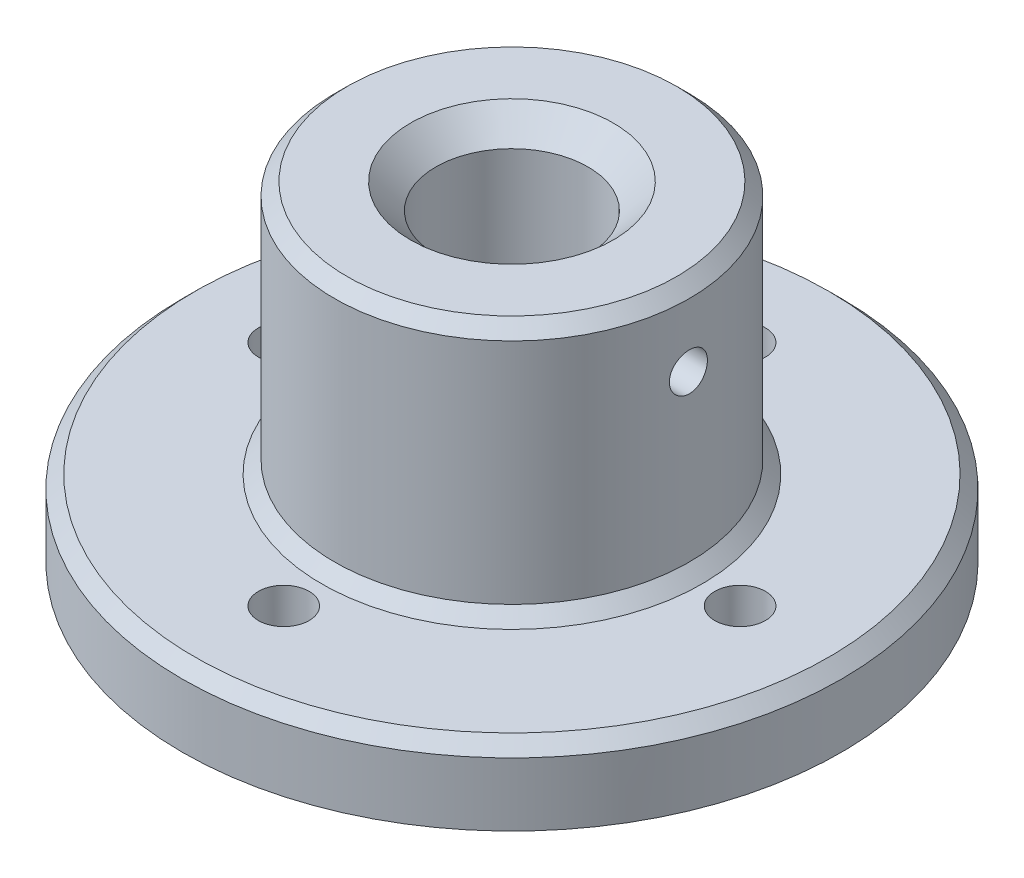
ISO-10303-21;
HEADER;
FILE_DESCRIPTION(('STEP AP214'),'2;1');
FILE_NAME('part.step','',(''),(''),'','','');
FILE_SCHEMA(('AUTOMOTIVE_DESIGN { 1 0 10303 214 1 1 1 1 }'));
ENDSEC;
DATA;
#1=APPLICATION_CONTEXT('core data for automotive mechanical design processes');
#2=APPLICATION_PROTOCOL_DEFINITION('international standard','automotive_design',2000,#1);
#3=PRODUCT_CONTEXT('',#1,'mechanical');
#4=PRODUCT('Part','Part','',(#3));
#5=PRODUCT_RELATED_PRODUCT_CATEGORY('part','',(#4));
#6=PRODUCT_DEFINITION_FORMATION('','',#4);
#7=PRODUCT_DEFINITION_CONTEXT('part definition',#1,'design');
#8=PRODUCT_DEFINITION('design','',#6,#7);
#9=PRODUCT_DEFINITION_SHAPE('','',#8);
#10=(LENGTH_UNIT() NAMED_UNIT(*) SI_UNIT(.MILLI.,.METRE.));
#11=(NAMED_UNIT(*) PLANE_ANGLE_UNIT() SI_UNIT($,.RADIAN.));
#12=(NAMED_UNIT(*) SI_UNIT($,.STERADIAN.) SOLID_ANGLE_UNIT());
#13=UNCERTAINTY_MEASURE_WITH_UNIT(LENGTH_MEASURE(1.E-05),#10,'distance_accuracy_value','');
#14=(GEOMETRIC_REPRESENTATION_CONTEXT(3) GLOBAL_UNCERTAINTY_ASSIGNED_CONTEXT((#13)) GLOBAL_UNIT_ASSIGNED_CONTEXT((#10,
#11,#12)) REPRESENTATION_CONTEXT('',''));
#15=CARTESIAN_POINT('',(0.,0.,0.));
#16=DIRECTION('',(0.,0.,1.));
#17=DIRECTION('',(1.,0.,0.));
#18=AXIS2_PLACEMENT_3D('',#15,#16,#17);
#19=CARTESIAN_POINT('',(0.,48.361075518852,0.));
#20=DIRECTION('',(0.,1.,0.));
#21=DIRECTION('',(0.,0.,1.));
#22=AXIS2_PLACEMENT_3D('',#19,#20,#21);
#23=CYLINDRICAL_SURFACE('',#22,9.525);
#24=CARTESIAN_POINT('',(0.,38.1,0.));
#25=DIRECTION('',(0.,-1.,0.));
#26=DIRECTION('',(0.,0.,-1.));
#27=AXIS2_PLACEMENT_3D('',#24,#25,#26);
#28=CIRCLE('',#27,9.525);
#29=CARTESIAN_POINT('',(0.,38.1,9.525));
#30=VERTEX_POINT('',#29);
#31=EDGE_CURVE('E129',#30,#30,#28,.F.);
#32=ORIENTED_EDGE('',*,*,#31,.T.);
#33=EDGE_LOOP('',(#32));
#34=FACE_BOUND('',#33,.T.);
#35=CARTESIAN_POINT('',(0.,12.7,0.));
#36=DIRECTION('',(0.,1.,0.));
#37=DIRECTION('',(0.,0.,1.));
#38=AXIS2_PLACEMENT_3D('',#35,#36,#37);
#39=CIRCLE('',#38,9.525);
#40=CARTESIAN_POINT('',(0.,12.7,9.525));
#41=VERTEX_POINT('',#40);
#42=EDGE_CURVE('E109',#41,#41,#39,.T.);
#43=ORIENTED_EDGE('',*,*,#42,.F.);
#44=EDGE_LOOP('',(#43));
#45=FACE_BOUND('',#44,.T.);
#46=CARTESIAN_POINT('',(9.22254159315641,31.75,2.38125));
#47=CARTESIAN_POINT('',(9.22254410333687,31.8814933402576,2.3812462648599));
#48=CARTESIAN_POINT('',(9.22538451478904,32.0130280159913,2.37032124883651));
#49=CARTESIAN_POINT('',(9.23641023547917,32.2723201182103,2.32697952700426));
#50=CARTESIAN_POINT('',(9.24459865537102,32.4000753011309,2.29455031317185));
#51=CARTESIAN_POINT('',(9.26533635177833,32.6480203701233,2.20931536764952));
#52=CARTESIAN_POINT('',(9.27787999662661,32.7682197905049,2.1565359407814));
#53=CARTESIAN_POINT('',(9.30590777907392,32.9980710870442,2.03217888705147));
#54=CARTESIAN_POINT('',(9.32139204150511,33.1077225151314,1.96060046210405));
#55=CARTESIAN_POINT('',(9.35393782328732,33.3157782171123,1.79899477701457));
#56=CARTESIAN_POINT('',(9.3710245423594,33.4139161543334,1.70862963553811));
#57=CARTESIAN_POINT('',(9.40463138928317,33.5938127281282,1.51274341605588));
#58=CARTESIAN_POINT('',(9.42115146404485,33.6755698334047,1.40722092270674));
#59=CARTESIAN_POINT('',(9.45204245783355,33.8214736329188,1.18219080402771));
#60=CARTESIAN_POINT('',(9.46638017249064,33.8853586847238,1.06250858382585));
#61=CARTESIAN_POINT('',(9.49100348359499,33.9920036860558,0.813685683038861));
#62=CARTESIAN_POINT('',(9.50128967785963,34.0347667524495,0.684546401216829));
#63=CARTESIAN_POINT('',(9.51647282802892,34.0971008124361,0.423251717713344));
#64=CARTESIAN_POINT('',(9.52147473886709,34.1171240862211,0.291210415370404));
#65=CARTESIAN_POINT('',(9.52589148387201,34.13482985626,0.0255544503477919));
#66=CARTESIAN_POINT('',(9.52530714407111,34.1325156555296,-0.108059976797507));
#67=CARTESIAN_POINT('',(9.5186953544324,34.1059374551367,-0.369932538579244));
#68=CARTESIAN_POINT('',(9.51278897229679,34.0821616503862,-0.498243738400037));
#69=CARTESIAN_POINT('',(9.49633771789926,34.0141198652788,-0.748994201653837));
#70=CARTESIAN_POINT('',(9.48579259872026,33.969852794178,-0.871433152125852));
#71=CARTESIAN_POINT('',(9.46106352990092,33.8616900514206,-1.10824971271367));
#72=CARTESIAN_POINT('',(9.44684756259498,33.7976206399597,-1.22254448888149));
#73=CARTESIAN_POINT('',(9.41631883378731,33.6518037156418,-1.43893132569829));
#74=CARTESIAN_POINT('',(9.40000570769149,33.570053127196,-1.54102125854736));
#75=CARTESIAN_POINT('',(9.36653937365312,33.3885774232618,-1.73301192104605));
#76=CARTESIAN_POINT('',(9.34937537847846,33.2884257150388,-1.82250797329781));
#77=CARTESIAN_POINT('',(9.31654578950254,33.0743560252029,-1.98352499526194));
#78=CARTESIAN_POINT('',(9.30088026575645,32.9604374005347,-2.0550451248346));
#79=CARTESIAN_POINT('',(9.27278273229926,32.7212737424732,-2.17833923223503));
#80=CARTESIAN_POINT('',(9.26036676990449,32.595976466877,-2.23001578134838));
#81=CARTESIAN_POINT('',(9.24038004741607,32.3380873416568,-2.31144513414038));
#82=CARTESIAN_POINT('',(9.23280825052703,32.2054970595547,-2.34120262935448));
#83=CARTESIAN_POINT('',(9.22358476597102,31.9405385747928,-2.37727773082929));
#84=CARTESIAN_POINT('',(9.22178199750529,31.8082570018427,-2.38419367640796));
#85=CARTESIAN_POINT('',(9.22388944554869,31.5444296054026,-2.37602743346569));
#86=CARTESIAN_POINT('',(9.22779913615711,31.4128837153032,-2.36094726995194));
#87=CARTESIAN_POINT('',(9.24074620590693,31.1564836626365,-2.30974150440119));
#88=CARTESIAN_POINT('',(9.24969864156011,31.0315552279428,-2.27396427503852));
#89=CARTESIAN_POINT('',(9.27164184145322,30.7894690363947,-2.18276622279112));
#90=CARTESIAN_POINT('',(9.28463308404703,30.6723122019994,-2.12734307294616));
#91=CARTESIAN_POINT('',(9.31350820583475,30.4465596828318,-1.99717406120961));
#92=CARTESIAN_POINT('',(9.329443830984,30.3381770298591,-1.92207047052845));
#93=CARTESIAN_POINT('',(9.36228521625235,30.1353330844316,-1.75512482255016));
#94=CARTESIAN_POINT('',(9.37919113548712,30.0408740843908,-1.66328001450545));
#95=CARTESIAN_POINT('',(9.41258026387764,29.8661349819512,-1.46271310434489));
#96=CARTESIAN_POINT('',(9.42904231213941,29.7862687904223,-1.35362621196586));
#97=CARTESIAN_POINT('',(9.45925098824539,29.6459885867289,-1.1232420131667));
#98=CARTESIAN_POINT('',(9.47299775771261,29.5855735599307,-1.00194534408027));
#99=CARTESIAN_POINT('',(9.49614035240754,29.4864351521122,-0.751422967872166));
#100=CARTESIAN_POINT('',(9.50556738096345,29.4475557691289,-0.622262013572651));
#101=CARTESIAN_POINT('',(9.51914491959489,29.3921240312855,-0.358972866759166));
#102=CARTESIAN_POINT('',(9.52329644797234,29.3755673675511,-0.22484563800446));
#103=CARTESIAN_POINT('',(9.52581365904719,29.3654934273232,0.0406801473431576));
#104=CARTESIAN_POINT('',(9.52433274707972,29.3713653052166,0.172054425462833));
#105=CARTESIAN_POINT('',(9.51609165939287,29.4045826387447,0.43188135083762));
#106=CARTESIAN_POINT('',(9.50933164068008,29.4319274557501,0.560334084865831));
#107=CARTESIAN_POINT('',(9.49131561983323,29.5069868483294,0.810032278629114));
#108=CARTESIAN_POINT('',(9.48008401721322,29.5545909732049,0.931312815220676));
#109=CARTESIAN_POINT('',(9.45430756725648,29.6687174412904,1.16423373255536));
#110=CARTESIAN_POINT('',(9.43976230230416,29.7352421692966,1.27587289576378));
#111=CARTESIAN_POINT('',(9.40849138301183,29.8871844009533,1.48923834205799));
#112=CARTESIAN_POINT('',(9.39172184092338,29.9730163402897,1.59066306588541));
#113=CARTESIAN_POINT('',(9.35808983067433,30.1603319162711,1.77787701702628));
#114=CARTESIAN_POINT('',(9.34122734003389,30.2618195152397,1.86366227408863));
#115=CARTESIAN_POINT('',(9.30896051857103,30.4798446175386,2.01873332553604));
#116=CARTESIAN_POINT('',(9.29358925997019,30.5966275687635,2.08768144998525));
#117=CARTESIAN_POINT('',(9.26649044022059,30.8404946352644,2.20486342249415));
#118=CARTESIAN_POINT('',(9.2547602298034,30.967571175511,2.25311234134731));
#119=CARTESIAN_POINT('',(9.23810482712693,31.2036865094325,2.3203436461597));
#120=CARTESIAN_POINT('',(9.23231253777081,31.3115955976945,2.34313373748382));
#121=CARTESIAN_POINT('',(9.22453003124864,31.5296602443007,2.37358783418652));
#122=CARTESIAN_POINT('',(9.22253948975938,31.639815610207,2.38125312984773));
#123=CARTESIAN_POINT('',(9.22254159315641,31.75,2.38125));
#124=B_SPLINE_CURVE_WITH_KNOTS('',3,(#46,#47,#48,#49,#50,#51,#52,#53,#54,#55,#56,#57,#58,#59,
#60,#61,#62,#63,#64,#65,#66,#67,#68,#69,#70,#71,#72,#73,#74,#75,#76,#77,#78,#79,#80,#81,#82,#83,
#84,#85,#86,#87,#88,#89,#90,#91,#92,#93,#94,#95,#96,#97,#98,#99,#100,#101,#102,#103,#104,#105,
#106,#107,#108,#109,#110,#111,#112,#113,#114,#115,#116,#117,#118,#119,#120,#121,#122,#123),
.UNSPECIFIED.,.T.,.F.,(4,2,2,2,2,2,2,2,2,2,2,2,2,2,2,2,2,2,2,2,2,2,2,2,2,2,2,2,2,2,2,2,2,2,2,2,
2,2,4),(0.,0.394075388253666,0.788380193710801,1.18217701762563,1.57599056234593,
1.97761816368809,2.37928329209573,2.78655300319018,3.19376259754355,3.59272285323067,
3.99162411604384,4.38167395211221,4.77174455280358,5.16533962727358,5.55900322159139,
5.96332119409744,6.36765805967811,6.77395551488003,7.18016598123394,7.57564754962904,
7.9710927114728,8.36006778275978,8.7490889415861,9.14574160685557,9.54245950492714,
9.94910377749175,10.3557268347758,10.7593644935331,11.1629242284057,11.5555723244111,
11.9482087430628,12.3387314492783,12.7293033997022,13.1292323449913,13.5292626757086,
13.936755946198,14.343952021097,14.674194303944,15.0044084129029),.UNSPECIFIED.);
#125=CARTESIAN_POINT('',(9.22254159315641,31.75,2.38125));
#126=VERTEX_POINT('',#125);
#127=EDGE_CURVE('E102',#126,#126,#124,.T.);
#128=ORIENTED_EDGE('',*,*,#127,.F.);
#129=EDGE_LOOP('',(#128));
#130=FACE_BOUND('',#129,.T.);
#131=ADVANCED_FACE('F43',(#34,#45,#130),#23,.F.);
#132=CARTESIAN_POINT('',(0.,48.361075518852,0.));
#133=DIRECTION('',(0.,1.,0.));
#134=DIRECTION('',(0.,0.,1.));
#135=AXIS2_PLACEMENT_3D('',#132,#133,#134);
#136=CYLINDRICAL_SURFACE('',#135,22.225);
#137=CARTESIAN_POINT('',(0.,11.1125,0.));
#138=DIRECTION('',(0.,-1.,0.));
#139=DIRECTION('',(0.,0.,-1.));
#140=AXIS2_PLACEMENT_3D('',#137,#138,#139);
#141=CIRCLE('',#140,22.225);
#142=CARTESIAN_POINT('',(0.,11.1125,-22.225));
#143=VERTEX_POINT('',#142);
#144=EDGE_CURVE('E58',#143,#143,#141,.F.);
#145=ORIENTED_EDGE('',*,*,#144,.T.);
#146=EDGE_LOOP('',(#145));
#147=FACE_BOUND('',#146,.T.);
#148=CARTESIAN_POINT('',(0.,39.6875,0.));
#149=DIRECTION('',(0.,-1.,0.));
#150=DIRECTION('',(0.,0.,-1.));
#151=AXIS2_PLACEMENT_3D('',#148,#149,#150);
#152=CIRCLE('',#151,22.225);
#153=CARTESIAN_POINT('',(0.,39.6875,-22.225));
#154=VERTEX_POINT('',#153);
#155=EDGE_CURVE('E64',#154,#154,#152,.T.);
#156=ORIENTED_EDGE('',*,*,#155,.T.);
#157=EDGE_LOOP('',(#156));
#158=FACE_BOUND('',#157,.T.);
#159=CARTESIAN_POINT('',(22.0970648149816,31.75,2.38125));
#160=CARTESIAN_POINT('',(22.0970664820833,31.6166566543685,2.38124424992973));
#161=CARTESIAN_POINT('',(22.0982848074785,31.4832264094941,2.37001197710508));
#162=CARTESIAN_POINT('',(22.103025490222,31.2200689950915,2.32537598328547));
#163=CARTESIAN_POINT('',(22.1065503520364,31.0903460109325,2.2919481615033));
#164=CARTESIAN_POINT('',(22.1155003657975,30.8384519200625,2.20390885620275));
#165=CARTESIAN_POINT('',(22.1209243292955,30.7162761464657,2.14931061873866));
#166=CARTESIAN_POINT('',(22.1330599489261,30.4828477733432,2.02050658503218));
#167=CARTESIAN_POINT('',(22.1397713586554,30.3715930897875,1.9463045397249));
#168=CARTESIAN_POINT('',(22.1537568755532,30.1626776618186,1.78006856421919));
#169=CARTESIAN_POINT('',(22.1610329714682,30.0650686999907,1.68796971750633));
#170=CARTESIAN_POINT('',(22.1753100262235,29.8866617715851,1.48869356394803));
#171=CARTESIAN_POINT('',(22.1823109721801,29.8058645914429,1.38151555210987));
#172=CARTESIAN_POINT('',(22.1952687819102,29.6631936822957,1.15480366058516));
#173=CARTESIAN_POINT('',(22.2012230846248,29.6013661026044,1.03524058007845));
#174=CARTESIAN_POINT('',(22.21139501034,29.4986847732947,0.787354809851176));
#175=CARTESIAN_POINT('',(22.2156126814728,29.4578304423783,0.659032363018367));
#176=CARTESIAN_POINT('',(22.2218221520862,29.3984080668079,0.397795785244165));
#177=CARTESIAN_POINT('',(22.2238224780854,29.3797546308883,0.264901283782864));
#178=CARTESIAN_POINT('',(22.2254009087708,29.3649992193971,-0.00214606369741539));
#179=CARTESIAN_POINT('',(22.2249790848306,29.36889657932,-0.136298872521493));
#180=CARTESIAN_POINT('',(22.221767700665,29.3990630452124,-0.401474711359468));
#181=CARTESIAN_POINT('',(22.2189878589336,29.4252403266971,-0.532508321511268));
#182=CARTESIAN_POINT('',(22.2113839013471,29.4990803789974,-0.788311592666256));
#183=CARTESIAN_POINT('',(22.2065597556045,29.5467434639341,-0.913081162059909));
#184=CARTESIAN_POINT('',(22.1953927288687,29.6623020230706,-1.15310268517908));
#185=CARTESIAN_POINT('',(22.1890468204965,29.7302378944353,-1.26833504309562));
#186=CARTESIAN_POINT('',(22.1755477903151,29.8843842316627,-1.48579731158137));
#187=CARTESIAN_POINT('',(22.1683946413121,29.9705953132544,-1.58802678387106));
#188=CARTESIAN_POINT('',(22.1540408744508,30.1593607244283,-1.77711962939844));
#189=CARTESIAN_POINT('',(22.1468401986374,30.2619949730649,-1.86390323722339));
#190=CARTESIAN_POINT('',(22.1332386863532,30.4804168968983,-2.01902271559633));
#191=CARTESIAN_POINT('',(22.126837851343,30.5962045961145,-2.08735855245616));
#192=CARTESIAN_POINT('',(22.1155603723591,30.8377105009573,-2.20364359444023));
#193=CARTESIAN_POINT('',(22.1106841255728,30.9634312836921,-2.25158748820562));
#194=CARTESIAN_POINT('',(22.1030160347943,31.2212025727177,-2.32566257688787));
#195=CARTESIAN_POINT('',(22.1002241176709,31.3532528567572,-2.35179453710676));
#196=CARTESIAN_POINT('',(22.0970536725561,31.6192333605724,-2.38140056745085));
#197=CARTESIAN_POINT('',(22.096663240123,31.7531510035851,-2.38498640333515));
#198=CARTESIAN_POINT('',(22.0983085400792,32.0196802053377,-2.3696922799674));
#199=CARTESIAN_POINT('',(22.1003442347372,32.1522917843573,-2.35081267010065));
#200=CARTESIAN_POINT('',(22.1066015805646,32.4121163188876,-2.29121724578066));
#201=CARTESIAN_POINT('',(22.1108179070273,32.5393416117527,-2.25055461289328));
#202=CARTESIAN_POINT('',(22.1209571278545,32.7851662573919,-2.14860181595665));
#203=CARTESIAN_POINT('',(22.1268800668847,32.9037653842994,-2.0873111120207));
#204=CARTESIAN_POINT('',(22.1397938909874,33.1294795474858,-1.94556337590222));
#205=CARTESIAN_POINT('',(22.1467888533591,33.2365479628,-1.86503248341998));
#206=CARTESIAN_POINT('',(22.1610453754943,33.4356878876036,-1.68719582560919));
#207=CARTESIAN_POINT('',(22.1683069428381,33.5277589702789,-1.58988958302776));
#208=CARTESIAN_POINT('',(22.182314590293,33.6946779883262,-1.38077863102557));
#209=CARTESIAN_POINT('',(22.18905840639,33.7694528719469,-1.26891543643893));
#210=CARTESIAN_POINT('',(22.2012375235669,33.8991534890153,-1.03415365878414));
#211=CARTESIAN_POINT('',(22.2066728448594,33.9540795290799,-0.911255246220109));
#212=CARTESIAN_POINT('',(22.2156123861663,34.0424003554481,-0.658163427893604));
#213=CARTESIAN_POINT('',(22.2191205161404,34.075838760277,-0.527985387325592));
#214=CARTESIAN_POINT('',(22.2238265018812,34.1203773649965,-0.263822894271637));
#215=CARTESIAN_POINT('',(22.2250244328724,34.1314782922377,-0.129838565869688));
#216=CARTESIAN_POINT('',(22.2249749259624,34.1310157248106,0.137416785862918));
#217=CARTESIAN_POINT('',(22.2237397017826,34.119565430669,0.270688021772255));
#218=CARTESIAN_POINT('',(22.2189868093002,34.0745634542405,0.533401688310272));
#219=CARTESIAN_POINT('',(22.2154691399757,34.0410117620573,0.662844117224497));
#220=CARTESIAN_POINT('',(22.2065452803502,33.9527919068326,0.914221143233191));
#221=CARTESIAN_POINT('',(22.2011394374474,33.8981276280233,1.03615711656207));
#222=CARTESIAN_POINT('',(22.189040765569,33.769246209088,1.26914146534895));
#223=CARTESIAN_POINT('',(22.1823479380201,33.6950290906375,1.38018985287626));
#224=CARTESIAN_POINT('',(22.1683842038663,33.5287254322321,1.58882663735036));
#225=CARTESIAN_POINT('',(22.1611106683196,33.436554549666,1.68634763122723));
#226=CARTESIAN_POINT('',(22.146827268395,33.2371294990927,1.86458686669421));
#227=CARTESIAN_POINT('',(22.1398174674624,33.1298717307431,1.94530108606954));
#228=CARTESIAN_POINT('',(22.1268336517078,32.9029740211887,2.08782410823142));
#229=CARTESIAN_POINT('',(22.1208626774724,32.7832993157361,2.14957780509113));
#230=CARTESIAN_POINT('',(22.1106685696351,32.5352887869448,2.25202913195297));
#231=CARTESIAN_POINT('',(22.1064434841166,32.4069628235737,2.29275028929643));
#232=CARTESIAN_POINT('',(22.1012746980544,32.1899383015984,2.34193195406394));
#233=CARTESIAN_POINT('',(22.099703560649,32.1026227181193,2.35665579827022));
#234=CARTESIAN_POINT('',(22.0975980687243,31.9268841678546,2.37631670404873));
#235=CARTESIAN_POINT('',(22.097063709011,31.8384612066189,2.3812538146497));
#236=CARTESIAN_POINT('',(22.0970648149816,31.75,2.38125));
#237=B_SPLINE_CURVE_WITH_KNOTS('',3,(#159,#160,#161,#162,#163,#164,#165,#166,#167,#168,#169,
#170,#171,#172,#173,#174,#175,#176,#177,#178,#179,#180,#181,#182,#183,#184,#185,#186,#187,#188,
#189,#190,#191,#192,#193,#194,#195,#196,#197,#198,#199,#200,#201,#202,#203,#204,#205,#206,#207,
#208,#209,#210,#211,#212,#213,#214,#215,#216,#217,#218,#219,#220,#221,#222,#223,#224,#225,#226,
#227,#228,#229,#230,#231,#232,#233,#234,#235,#236),.UNSPECIFIED.,.T.,.F.,(4,2,2,2,2,2,2,2,2,2,2,
2,2,2,2,2,2,2,2,2,2,2,2,2,2,2,2,2,2,2,2,2,2,2,2,2,2,2,4),(0.,0.399706962412221,
0.799848653454276,1.19974038398277,1.59955565574399,2.0008491883463,2.4021614887709,
2.80444250027053,3.20671236148111,3.60742992033587,4.00813567128774,4.40719790603781,
4.80626597524271,5.20613463055177,5.60601676039549,6.00790755168548,6.4097990768783,
6.81179521617566,7.2137772502866,7.61376499564718,8.01374652043194,8.41275594224327,
8.81177580791213,9.21235278734627,9.61294116493745,10.0151917614922,10.4174361439794,
10.8188613949833,11.2202735746116,11.6196759178646,12.0190784399585,12.4184075161163,
12.8177361495971,13.2189880628712,13.6203358940819,14.0228393760423,14.424891630575,
14.6900622482699,14.9552315375322),.UNSPECIFIED.);
#238=CARTESIAN_POINT('',(22.0970648149816,31.75,2.38125));
#239=VERTEX_POINT('',#238);
#240=EDGE_CURVE('E48',#239,#239,#237,.T.);
#241=ORIENTED_EDGE('',*,*,#240,.F.);
#242=EDGE_LOOP('',(#241));
#243=FACE_BOUND('',#242,.T.);
#244=ADVANCED_FACE('F152',(#147,#158,#243),#136,.T.);
#245=CARTESIAN_POINT('',(41.275,0.,0.));
#246=DIRECTION('',(0.,1.,0.));
#247=DIRECTION('',(0.,0.,1.));
#248=AXIS2_PLACEMENT_3D('',#245,#246,#247);
#249=PLANE('',#248);
#250=CARTESIAN_POINT('',(0.,0.,0.));
#251=DIRECTION('',(0.,1.,0.));
#252=DIRECTION('',(0.,0.,1.));
#253=AXIS2_PLACEMENT_3D('',#250,#251,#252);
#254=CIRCLE('',#253,41.275);
#255=CARTESIAN_POINT('',(0.,0.,41.275));
#256=VERTEX_POINT('',#255);
#257=EDGE_CURVE('E77',#256,#256,#254,.T.);
#258=ORIENTED_EDGE('',*,*,#257,.F.);
#259=EDGE_LOOP('',(#258));
#260=FACE_BOUND('',#259,.T.);
#261=CARTESIAN_POINT('',(0.,0.,0.));
#262=DIRECTION('',(0.,1.,0.));
#263=DIRECTION('',(0.,0.,1.));
#264=AXIS2_PLACEMENT_3D('',#261,#262,#263);
#265=CIRCLE('',#264,34.925);
#266=CARTESIAN_POINT('',(0.,0.,34.925));
#267=VERTEX_POINT('',#266);
#268=EDGE_CURVE('E125',#267,#267,#265,.T.);
#269=ORIENTED_EDGE('',*,*,#268,.T.);
#270=EDGE_LOOP('',(#269));
#271=FACE_BOUND('',#270,.T.);
#272=ADVANCED_FACE('F174',(#260,#271),#249,.F.);
#273=CARTESIAN_POINT('',(0.,48.361075518852,0.));
#274=DIRECTION('',(0.,1.,0.));
#275=DIRECTION('',(0.,0.,1.));
#276=AXIS2_PLACEMENT_3D('',#273,#274,#275);
#277=CYLINDRICAL_SURFACE('',#276,34.925);
#278=ORIENTED_EDGE('',*,*,#268,.F.);
#279=EDGE_LOOP('',(#278));
#280=FACE_BOUND('',#279,.T.);
#281=CARTESIAN_POINT('',(0.,3.175,0.));
#282=DIRECTION('',(0.,1.,0.));
#283=DIRECTION('',(0.,0.,1.));
#284=AXIS2_PLACEMENT_3D('',#281,#282,#283);
#285=CIRCLE('',#284,34.925);
#286=CARTESIAN_POINT('',(0.,3.175,34.925));
#287=VERTEX_POINT('',#286);
#288=EDGE_CURVE('E121',#287,#287,#285,.T.);
#289=ORIENTED_EDGE('',*,*,#288,.T.);
#290=EDGE_LOOP('',(#289));
#291=FACE_BOUND('',#290,.T.);
#292=ADVANCED_FACE('F252',(#280,#291),#277,.F.);
#293=CARTESIAN_POINT('',(34.925,3.175,0.));
#294=DIRECTION('',(0.,1.,0.));
#295=DIRECTION('',(0.,0.,1.));
#296=AXIS2_PLACEMENT_3D('',#293,#294,#295);
#297=PLANE('',#296);
#298=CARTESIAN_POINT('',(0.,3.175,28.575));
#299=DIRECTION('',(0.,1.,0.));
#300=DIRECTION('',(-1.,0.,0.));
#301=AXIS2_PLACEMENT_3D('',#298,#299,#300);
#302=CIRCLE('',#301,3.175);
#303=CARTESIAN_POINT('',(-3.1750000000001,3.175,28.575));
#304=VERTEX_POINT('',#303);
#305=EDGE_CURVE('E71',#304,#304,#302,.T.);
#306=ORIENTED_EDGE('',*,*,#305,.T.);
#307=EDGE_LOOP('',(#306));
#308=FACE_BOUND('',#307,.T.);
#309=CARTESIAN_POINT('',(-28.575,3.175,0.));
#310=DIRECTION('',(0.,1.,0.));
#311=DIRECTION('',(0.,0.,-1.));
#312=AXIS2_PLACEMENT_3D('',#309,#310,#311);
#313=CIRCLE('',#312,3.175);
#314=CARTESIAN_POINT('',(-28.575,3.175,-3.175));
#315=VERTEX_POINT('',#314);
#316=EDGE_CURVE('E86',#315,#315,#313,.T.);
#317=ORIENTED_EDGE('',*,*,#316,.T.);
#318=EDGE_LOOP('',(#317));
#319=FACE_BOUND('',#318,.T.);
#320=CARTESIAN_POINT('',(2.99307237772328E-13,3.175,-28.575));
#321=DIRECTION('',(0.,1.,0.));
#322=DIRECTION('',(1.,0.,0.));
#323=AXIS2_PLACEMENT_3D('',#320,#321,#322);
#324=CIRCLE('',#323,3.175);
#325=CARTESIAN_POINT('',(3.1750000000003,3.175,-28.575));
#326=VERTEX_POINT('',#325);
#327=EDGE_CURVE('E94',#326,#326,#324,.T.);
#328=ORIENTED_EDGE('',*,*,#327,.T.);
#329=EDGE_LOOP('',(#328));
#330=FACE_BOUND('',#329,.T.);
#331=CARTESIAN_POINT('',(28.575,3.175,0.));
#332=DIRECTION('',(0.,1.,0.));
#333=DIRECTION('',(0.,0.,1.));
#334=AXIS2_PLACEMENT_3D('',#331,#332,#333);
#335=CIRCLE('',#334,3.175);
#336=CARTESIAN_POINT('',(28.575,3.175,3.175));
#337=VERTEX_POINT('',#336);
#338=EDGE_CURVE('E70',#337,#337,#335,.T.);
#339=ORIENTED_EDGE('',*,*,#338,.T.);
#340=EDGE_LOOP('',(#339));
#341=FACE_BOUND('',#340,.T.);
#342=ORIENTED_EDGE('',*,*,#288,.F.);
#343=EDGE_LOOP('',(#342));
#344=FACE_BOUND('',#343,.T.);
#345=CARTESIAN_POINT('',(0.,3.175,0.));
#346=DIRECTION('',(0.,1.,0.));
#347=DIRECTION('',(0.,0.,1.));
#348=AXIS2_PLACEMENT_3D('',#345,#346,#347);
#349=CIRCLE('',#348,12.7);
#350=CARTESIAN_POINT('',(0.,3.175,12.7));
#351=VERTEX_POINT('',#350);
#352=EDGE_CURVE('E117',#351,#351,#349,.T.);
#353=ORIENTED_EDGE('',*,*,#352,.T.);
#354=EDGE_LOOP('',(#353));
#355=FACE_BOUND('',#354,.T.);
#356=ADVANCED_FACE('F256',(#308,#319,#330,#341,#344,#355),#297,.F.);
#357=CARTESIAN_POINT('',(0.,48.361075518852,0.));
#358=DIRECTION('',(0.,1.,0.));
#359=DIRECTION('',(0.,0.,1.));
#360=AXIS2_PLACEMENT_3D('',#357,#358,#359);
#361=CYLINDRICAL_SURFACE('',#360,12.7);
#362=ORIENTED_EDGE('',*,*,#352,.F.);
#363=EDGE_LOOP('',(#362));
#364=FACE_BOUND('',#363,.T.);
#365=CARTESIAN_POINT('',(0.,12.7,0.));
#366=DIRECTION('',(0.,1.,0.));
#367=DIRECTION('',(0.,0.,1.));
#368=AXIS2_PLACEMENT_3D('',#365,#366,#367);
#369=CIRCLE('',#368,12.7);
#370=CARTESIAN_POINT('',(0.,12.7,12.7));
#371=VERTEX_POINT('',#370);
#372=EDGE_CURVE('E113',#371,#371,#369,.T.);
#373=ORIENTED_EDGE('',*,*,#372,.T.);
#374=EDGE_LOOP('',(#373));
#375=FACE_BOUND('',#374,.T.);
#376=ADVANCED_FACE('F259',(#364,#375),#361,.F.);
#377=CARTESIAN_POINT('',(12.7,12.7,0.));
#378=DIRECTION('',(0.,1.,0.));
#379=DIRECTION('',(0.,0.,1.));
#380=AXIS2_PLACEMENT_3D('',#377,#378,#379);
#381=PLANE('',#380);
#382=ORIENTED_EDGE('',*,*,#372,.F.);
#383=EDGE_LOOP('',(#382));
#384=FACE_BOUND('',#383,.T.);
#385=ORIENTED_EDGE('',*,*,#42,.T.);
#386=EDGE_LOOP('',(#385));
#387=FACE_BOUND('',#386,.T.);
#388=ADVANCED_FACE('F181',(#384,#387),#381,.F.);
#389=CARTESIAN_POINT('',(9.525,41.275,0.));
#390=DIRECTION('',(0.,-1.,0.));
#391=DIRECTION('',(0.,0.,-1.));
#392=AXIS2_PLACEMENT_3D('',#389,#390,#391);
#393=PLANE('',#392);
#394=CARTESIAN_POINT('',(0.,41.275,0.));
#395=DIRECTION('',(0.,-1.,0.));
#396=DIRECTION('',(0.,0.,-1.));
#397=AXIS2_PLACEMENT_3D('',#394,#395,#396);
#398=CIRCLE('',#397,20.6375);
#399=CARTESIAN_POINT('',(0.,41.275,-20.6375));
#400=VERTEX_POINT('',#399);
#401=EDGE_CURVE('E10',#400,#400,#398,.F.);
#402=ORIENTED_EDGE('',*,*,#401,.T.);
#403=EDGE_LOOP('',(#402));
#404=FACE_BOUND('',#403,.T.);
#405=CARTESIAN_POINT('',(0.,41.275,0.));
#406=DIRECTION('',(0.,-1.,0.));
#407=DIRECTION('',(0.,0.,-1.));
#408=AXIS2_PLACEMENT_3D('',#405,#406,#407);
#409=CIRCLE('',#408,12.7);
#410=CARTESIAN_POINT('',(0.,41.275,12.7));
#411=VERTEX_POINT('',#410);
#412=EDGE_CURVE('E133',#411,#411,#409,.T.);
#413=ORIENTED_EDGE('',*,*,#412,.T.);
#414=EDGE_LOOP('',(#413));
#415=FACE_BOUND('',#414,.T.);
#416=ADVANCED_FACE('F180',(#404,#415),#393,.F.);
#417=CARTESIAN_POINT('',(22.225,9.525,0.));
#418=DIRECTION('',(0.,-1.,0.));
#419=DIRECTION('',(0.,0.,-1.));
#420=AXIS2_PLACEMENT_3D('',#417,#418,#419);
#421=PLANE('',#420);
#422=CARTESIAN_POINT('',(0.,9.525,28.575));
#423=DIRECTION('',(0.,-1.,0.));
#424=DIRECTION('',(1.,0.,0.));
#425=AXIS2_PLACEMENT_3D('',#422,#423,#424);
#426=CIRCLE('',#425,3.175);
#427=CARTESIAN_POINT('',(3.1749999999999,9.525,28.575));
#428=VERTEX_POINT('',#427);
#429=EDGE_CURVE('E80',#428,#428,#426,.T.);
#430=ORIENTED_EDGE('',*,*,#429,.T.);
#431=EDGE_LOOP('',(#430));
#432=FACE_BOUND('',#431,.T.);
#433=CARTESIAN_POINT('',(-28.575,9.525,0.));
#434=DIRECTION('',(0.,-1.,0.));
#435=DIRECTION('',(0.,0.,1.));
#436=AXIS2_PLACEMENT_3D('',#433,#434,#435);
#437=CIRCLE('',#436,3.175);
#438=CARTESIAN_POINT('',(-28.575,9.525,3.175));
#439=VERTEX_POINT('',#438);
#440=EDGE_CURVE('E90',#439,#439,#437,.T.);
#441=ORIENTED_EDGE('',*,*,#440,.T.);
#442=EDGE_LOOP('',(#441));
#443=FACE_BOUND('',#442,.T.);
#444=CARTESIAN_POINT('',(2.99307237772328E-13,9.525,-28.575));
#445=DIRECTION('',(0.,-1.,0.));
#446=DIRECTION('',(-1.,0.,0.));
#447=AXIS2_PLACEMENT_3D('',#444,#445,#446);
#448=CIRCLE('',#447,3.175);
#449=CARTESIAN_POINT('',(-3.1749999999997,9.525,-28.575));
#450=VERTEX_POINT('',#449);
#451=EDGE_CURVE('E98',#450,#450,#448,.T.);
#452=ORIENTED_EDGE('',*,*,#451,.T.);
#453=EDGE_LOOP('',(#452));
#454=FACE_BOUND('',#453,.T.);
#455=CARTESIAN_POINT('',(28.575,9.525,0.));
#456=DIRECTION('',(0.,-1.,0.));
#457=DIRECTION('',(0.,0.,-1.));
#458=AXIS2_PLACEMENT_3D('',#455,#456,#457);
#459=CIRCLE('',#458,3.175);
#460=CARTESIAN_POINT('',(28.575,9.525,-3.175));
#461=VERTEX_POINT('',#460);
#462=EDGE_CURVE('E67',#461,#461,#459,.T.);
#463=ORIENTED_EDGE('',*,*,#462,.T.);
#464=EDGE_LOOP('',(#463));
#465=FACE_BOUND('',#464,.T.);
#466=CARTESIAN_POINT('',(0.,9.525,0.));
#467=DIRECTION('',(0.,-1.,0.));
#468=DIRECTION('',(0.,0.,-1.));
#469=AXIS2_PLACEMENT_3D('',#466,#467,#468);
#470=CIRCLE('',#469,39.6875);
#471=CARTESIAN_POINT('',(0.,9.525,-39.6875));
#472=VERTEX_POINT('',#471);
#473=EDGE_CURVE('E141',#472,#472,#470,.F.);
#474=ORIENTED_EDGE('',*,*,#473,.T.);
#475=EDGE_LOOP('',(#474));
#476=FACE_BOUND('',#475,.T.);
#477=CARTESIAN_POINT('',(0.,9.525,0.));
#478=DIRECTION('',(0.,-1.,0.));
#479=DIRECTION('',(0.,0.,-1.));
#480=AXIS2_PLACEMENT_3D('',#477,#478,#479);
#481=CIRCLE('',#480,23.8125);
#482=CARTESIAN_POINT('',(0.,9.525,-23.8125));
#483=VERTEX_POINT('',#482);
#484=EDGE_CURVE('E137',#483,#483,#481,.T.);
#485=ORIENTED_EDGE('',*,*,#484,.T.);
#486=EDGE_LOOP('',(#485));
#487=FACE_BOUND('',#486,.T.);
#488=ADVANCED_FACE('F209',(#432,#443,#454,#465,#476,#487),#421,.F.);
#489=CARTESIAN_POINT('',(0.,48.361075518852,0.));
#490=DIRECTION('',(0.,1.,0.));
#491=DIRECTION('',(0.,0.,1.));
#492=AXIS2_PLACEMENT_3D('',#489,#490,#491);
#493=CYLINDRICAL_SURFACE('',#492,41.275);
#494=CARTESIAN_POINT('',(0.,7.93749999999997,0.));
#495=DIRECTION('',(0.,-1.,0.));
#496=DIRECTION('',(0.,0.,-1.));
#497=AXIS2_PLACEMENT_3D('',#494,#495,#496);
#498=CIRCLE('',#497,41.275);
#499=CARTESIAN_POINT('',(0.,7.93749999999997,-41.275));
#500=VERTEX_POINT('',#499);
#501=EDGE_CURVE('E145',#500,#500,#498,.T.);
#502=ORIENTED_EDGE('',*,*,#501,.T.);
#503=EDGE_LOOP('',(#502));
#504=FACE_BOUND('',#503,.T.);
#505=ORIENTED_EDGE('',*,*,#257,.T.);
#506=EDGE_LOOP('',(#505));
#507=FACE_BOUND('',#506,.T.);
#508=ADVANCED_FACE('F205',(#504,#507),#493,.T.);
#509=CARTESIAN_POINT('',(0.,38.1,0.));
#510=DIRECTION('',(0.,1.,0.));
#511=DIRECTION('',(0.,0.,1.));
#512=AXIS2_PLACEMENT_3D('',#509,#510,#511);
#513=CONICAL_SURFACE('',#512,9.525,0.785398163397454);
#514=CARTESIAN_POINT('',(0.,41.275,12.7));
#515=CARTESIAN_POINT('',(0.,41.2419270833333,12.6669270833334));
#516=CARTESIAN_POINT('',(0.,41.2088541666667,12.6338541666667));
#517=CARTESIAN_POINT('',(0.,41.1427083333333,12.5677083333334));
#518=CARTESIAN_POINT('',(0.,41.1096354166667,12.5346354166667));
#519=CARTESIAN_POINT('',(0.,41.0434895833333,12.4684895833334));
#520=CARTESIAN_POINT('',(0.,41.0104166666667,12.4354166666667));
#521=CARTESIAN_POINT('',(0.,40.9442708333333,12.3692708333334));
#522=CARTESIAN_POINT('',(0.,40.9111979166667,12.3361979166667));
#523=CARTESIAN_POINT('',(0.,40.8450520833333,12.2700520833334));
#524=CARTESIAN_POINT('',(0.,40.8119791666667,12.2369791666667));
#525=CARTESIAN_POINT('',(0.,40.7458333333333,12.1708333333334));
#526=CARTESIAN_POINT('',(0.,40.7127604166667,12.1377604166667));
#527=CARTESIAN_POINT('',(0.,40.6466145833333,12.0716145833334));
#528=CARTESIAN_POINT('',(0.,40.6135416666667,12.0385416666667));
#529=CARTESIAN_POINT('',(0.,40.5473958333333,11.9723958333334));
#530=CARTESIAN_POINT('',(0.,40.5143229166667,11.9393229166667));
#531=CARTESIAN_POINT('',(0.,40.4481770833333,11.8731770833334));
#532=CARTESIAN_POINT('',(0.,40.4151041666667,11.8401041666667));
#533=CARTESIAN_POINT('',(0.,40.3489583333333,11.7739583333334));
#534=CARTESIAN_POINT('',(0.,40.3158854166667,11.7408854166667));
#535=CARTESIAN_POINT('',(0.,40.2497395833333,11.6747395833334));
#536=CARTESIAN_POINT('',(0.,40.2166666666667,11.6416666666667));
#537=CARTESIAN_POINT('',(0.,40.1505208333333,11.5755208333334));
#538=CARTESIAN_POINT('',(0.,40.1174479166667,11.5424479166667));
#539=CARTESIAN_POINT('',(0.,40.0513020833333,11.4763020833334));
#540=CARTESIAN_POINT('',(0.,40.0182291666667,11.4432291666667));
#541=CARTESIAN_POINT('',(0.,39.9520833333333,11.3770833333334));
#542=CARTESIAN_POINT('',(0.,39.9190104166667,11.3440104166667));
#543=CARTESIAN_POINT('',(0.,39.8528645833333,11.2778645833334));
#544=CARTESIAN_POINT('',(0.,39.8197916666667,11.2447916666667));
#545=CARTESIAN_POINT('',(0.,39.7536458333333,11.1786458333334));
#546=CARTESIAN_POINT('',(0.,39.7205729166667,11.1455729166667));
#547=CARTESIAN_POINT('',(0.,39.6544270833333,11.0794270833334));
#548=CARTESIAN_POINT('',(0.,39.6213541666667,11.0463541666667));
#549=CARTESIAN_POINT('',(0.,39.5552083333333,10.9802083333334));
#550=CARTESIAN_POINT('',(0.,39.5221354166667,10.9471354166667));
#551=CARTESIAN_POINT('',(0.,39.4559895833333,10.8809895833334));
#552=CARTESIAN_POINT('',(0.,39.4229166666667,10.8479166666667));
#553=CARTESIAN_POINT('',(0.,39.3567708333333,10.7817708333334));
#554=CARTESIAN_POINT('',(0.,39.3236979166667,10.7486979166667));
#555=CARTESIAN_POINT('',(0.,39.2575520833333,10.6825520833334));
#556=CARTESIAN_POINT('',(0.,39.2244791666667,10.6494791666667));
#557=CARTESIAN_POINT('',(0.,39.1583333333333,10.5833333333333));
#558=CARTESIAN_POINT('',(0.,39.1252604166667,10.5502604166667));
#559=CARTESIAN_POINT('',(0.,39.0591145833333,10.4841145833333));
#560=CARTESIAN_POINT('',(0.,39.0260416666667,10.4510416666667));
#561=CARTESIAN_POINT('',(0.,38.9598958333333,10.3848958333333));
#562=CARTESIAN_POINT('',(0.,38.9268229166667,10.3518229166667));
#563=CARTESIAN_POINT('',(0.,38.8606770833333,10.2856770833333));
#564=CARTESIAN_POINT('',(0.,38.8276041666667,10.2526041666667));
#565=CARTESIAN_POINT('',(0.,38.7614583333333,10.1864583333333));
#566=CARTESIAN_POINT('',(0.,38.7283854166667,10.1533854166667));
#567=CARTESIAN_POINT('',(0.,38.6622395833333,10.0872395833333));
#568=CARTESIAN_POINT('',(0.,38.6291666666667,10.0541666666667));
#569=CARTESIAN_POINT('',(0.,38.5630208333333,9.98802083333334));
#570=CARTESIAN_POINT('',(0.,38.5299479166667,9.95494791666668));
#571=CARTESIAN_POINT('',(0.,38.4638020833333,9.88880208333334));
#572=CARTESIAN_POINT('',(0.,38.4307291666667,9.85572916666667));
#573=CARTESIAN_POINT('',(0.,38.3645833333333,9.78958333333334));
#574=CARTESIAN_POINT('',(0.,38.3315104166667,9.75651041666667));
#575=CARTESIAN_POINT('',(0.,38.2653645833333,9.69036458333334));
#576=CARTESIAN_POINT('',(0.,38.2322916666667,9.65729166666667));
#577=CARTESIAN_POINT('',(0.,38.1661458333333,9.59114583333334));
#578=CARTESIAN_POINT('',(0.,38.1330729166667,9.55807291666667));
#579=CARTESIAN_POINT('',(0.,38.1,9.525));
#580=B_SPLINE_CURVE_WITH_KNOTS('',3,(#514,#515,#516,#517,#518,#519,#520,#521,#522,#523,#524,
#525,#526,#527,#528,#529,#530,#531,#532,#533,#534,#535,#536,#537,#538,#539,#540,#541,#542,#543,
#544,#545,#546,#547,#548,#549,#550,#551,#552,#553,#554,#555,#556,#557,#558,#559,#560,#561,#562,
#563,#564,#565,#566,#567,#568,#569,#570,#571,#572,#573,#574,#575,#576,#577,#578,#579),
.UNSPECIFIED.,.F.,.F.,(4,2,2,2,2,2,2,2,2,2,2,2,2,2,2,2,2,2,2,2,2,2,2,2,2,2,2,2,2,2,2,2,4),(0.,
0.140316501891705,0.28063300378341,0.420949505675119,0.561266007566824,0.70158250945853,
0.84189901135024,0.982215513241945,1.12253201513365,1.26284851702536,1.40316501891706,
1.54348152080877,1.68379802270048,1.82411452459218,1.96443102648389,2.1047475283756,
2.24506403026731,2.38538053215901,2.52569703405072,2.66601353594243,2.80633003783413,
2.94664653972584,3.08696304161755,3.22727954350925,3.36759604540096,3.50791254729267,
3.64822904918437,3.78854555107608,3.92886205296779,4.0691785548595,4.2094950567512,
4.34981155864291,4.49012806053462),.UNSPECIFIED.);
#581=EDGE_CURVE('BSEAM208',#411,#30,#580,.T.);
#582=ORIENTED_EDGE('',*,*,#412,.F.);
#583=ORIENTED_EDGE('',*,*,#31,.F.);
#584=ORIENTED_EDGE('',*,*,#581,.T.);
#585=ORIENTED_EDGE('',*,*,#581,.F.);
#586=EDGE_LOOP('',(#582,#584,#583,#585));
#587=FACE_BOUND('',#586,.T.);
#588=ADVANCED_FACE('F208',(#587),#513,.F.);
#589=CARTESIAN_POINT('',(0.,9.525,0.));
#590=DIRECTION('',(0.,-1.,0.));
#591=DIRECTION('',(0.,0.,-1.));
#592=AXIS2_PLACEMENT_3D('',#589,#590,#591);
#593=CONICAL_SURFACE('',#592,39.6875,0.785398163397448);
#594=ORIENTED_EDGE('',*,*,#501,.F.);
#595=EDGE_LOOP('',(#594));
#596=FACE_BOUND('',#595,.T.);
#597=ORIENTED_EDGE('',*,*,#473,.F.);
#598=EDGE_LOOP('',(#597));
#599=FACE_BOUND('',#598,.T.);
#600=ADVANCED_FACE('F166',(#596,#599),#593,.T.);
#601=CARTESIAN_POINT('',(0.,11.1125,0.));
#602=DIRECTION('',(0.,-1.,0.));
#603=DIRECTION('',(0.,0.,-1.));
#604=AXIS2_PLACEMENT_3D('',#601,#602,#603);
#605=CONICAL_SURFACE('',#604,22.225,0.78539816339744);
#606=ORIENTED_EDGE('',*,*,#484,.F.);
#607=EDGE_LOOP('',(#606));
#608=FACE_BOUND('',#607,.T.);
#609=ORIENTED_EDGE('',*,*,#144,.F.);
#610=EDGE_LOOP('',(#609));
#611=FACE_BOUND('',#610,.T.);
#612=ADVANCED_FACE('F158',(#608,#611),#605,.T.);
#613=CARTESIAN_POINT('',(0.,41.275,0.));
#614=DIRECTION('',(0.,-1.,0.));
#615=DIRECTION('',(0.,0.,-1.));
#616=AXIS2_PLACEMENT_3D('',#613,#614,#615);
#617=CONICAL_SURFACE('',#616,20.6375,0.785398163397447);
#618=CARTESIAN_POINT('',(0.,39.6875,-22.225));
#619=CARTESIAN_POINT('',(0.,39.7040364583333,-22.2084635416667));
#620=CARTESIAN_POINT('',(0.,39.7205729166667,-22.1919270833333));
#621=CARTESIAN_POINT('',(0.,39.7536458333333,-22.1588541666667));
#622=CARTESIAN_POINT('',(0.,39.7701822916667,-22.1423177083333));
#623=CARTESIAN_POINT('',(0.,39.8032552083333,-22.1092447916667));
#624=CARTESIAN_POINT('',(0.,39.8197916666667,-22.0927083333333));
#625=CARTESIAN_POINT('',(0.,39.8528645833333,-22.0596354166667));
#626=CARTESIAN_POINT('',(0.,39.8694010416667,-22.0430989583333));
#627=CARTESIAN_POINT('',(0.,39.9024739583333,-22.0100260416667));
#628=CARTESIAN_POINT('',(0.,39.9190104166667,-21.9934895833333));
#629=CARTESIAN_POINT('',(0.,39.9520833333333,-21.9604166666667));
#630=CARTESIAN_POINT('',(0.,39.9686197916667,-21.9438802083333));
#631=CARTESIAN_POINT('',(0.,40.0016927083333,-21.9108072916667));
#632=CARTESIAN_POINT('',(0.,40.0182291666667,-21.8942708333333));
#633=CARTESIAN_POINT('',(0.,40.0513020833333,-21.8611979166667));
#634=CARTESIAN_POINT('',(0.,40.0678385416667,-21.8446614583333));
#635=CARTESIAN_POINT('',(0.,40.1009114583333,-21.8115885416667));
#636=CARTESIAN_POINT('',(0.,40.1174479166667,-21.7950520833333));
#637=CARTESIAN_POINT('',(0.,40.1505208333333,-21.7619791666667));
#638=CARTESIAN_POINT('',(0.,40.1670572916667,-21.7454427083333));
#639=CARTESIAN_POINT('',(0.,40.2001302083333,-21.7123697916667));
#640=CARTESIAN_POINT('',(0.,40.2166666666667,-21.6958333333333));
#641=CARTESIAN_POINT('',(0.,40.2497395833333,-21.6627604166667));
#642=CARTESIAN_POINT('',(0.,40.2662760416667,-21.6462239583333));
#643=CARTESIAN_POINT('',(0.,40.2993489583333,-21.6131510416667));
#644=CARTESIAN_POINT('',(0.,40.3158854166667,-21.5966145833333));
#645=CARTESIAN_POINT('',(0.,40.3489583333333,-21.5635416666667));
#646=CARTESIAN_POINT('',(0.,40.3654947916667,-21.5470052083333));
#647=CARTESIAN_POINT('',(0.,40.3985677083333,-21.5139322916667));
#648=CARTESIAN_POINT('',(0.,40.4151041666667,-21.4973958333333));
#649=CARTESIAN_POINT('',(0.,40.4481770833333,-21.4643229166667));
#650=CARTESIAN_POINT('',(0.,40.4647135416667,-21.4477864583333));
#651=CARTESIAN_POINT('',(0.,40.4977864583333,-21.4147135416667));
#652=CARTESIAN_POINT('',(0.,40.5143229166667,-21.3981770833333));
#653=CARTESIAN_POINT('',(0.,40.5473958333333,-21.3651041666667));
#654=CARTESIAN_POINT('',(0.,40.5639322916667,-21.3485677083333));
#655=CARTESIAN_POINT('',(0.,40.5970052083333,-21.3154947916667));
#656=CARTESIAN_POINT('',(0.,40.6135416666667,-21.2989583333333));
#657=CARTESIAN_POINT('',(0.,40.6466145833333,-21.2658854166667));
#658=CARTESIAN_POINT('',(0.,40.6631510416667,-21.2493489583333));
#659=CARTESIAN_POINT('',(0.,40.6962239583333,-21.2162760416667));
#660=CARTESIAN_POINT('',(0.,40.7127604166667,-21.1997395833333));
#661=CARTESIAN_POINT('',(0.,40.7458333333333,-21.1666666666667));
#662=CARTESIAN_POINT('',(0.,40.7623697916667,-21.1501302083333));
#663=CARTESIAN_POINT('',(0.,40.7954427083333,-21.1170572916667));
#664=CARTESIAN_POINT('',(0.,40.8119791666667,-21.1005208333333));
#665=CARTESIAN_POINT('',(0.,40.8450520833333,-21.0674479166667));
#666=CARTESIAN_POINT('',(0.,40.8615885416667,-21.0509114583333));
#667=CARTESIAN_POINT('',(0.,40.8946614583333,-21.0178385416667));
#668=CARTESIAN_POINT('',(0.,40.9111979166667,-21.0013020833333));
#669=CARTESIAN_POINT('',(0.,40.9442708333333,-20.9682291666667));
#670=CARTESIAN_POINT('',(0.,40.9608072916667,-20.9516927083333));
#671=CARTESIAN_POINT('',(0.,40.9938802083333,-20.9186197916667));
#672=CARTESIAN_POINT('',(0.,41.0104166666667,-20.9020833333333));
#673=CARTESIAN_POINT('',(0.,41.0434895833333,-20.8690104166667));
#674=CARTESIAN_POINT('',(0.,41.0600260416667,-20.8524739583333));
#675=CARTESIAN_POINT('',(0.,41.0930989583333,-20.8194010416667));
#676=CARTESIAN_POINT('',(0.,41.1096354166667,-20.8028645833333));
#677=CARTESIAN_POINT('',(0.,41.1427083333333,-20.7697916666667));
#678=CARTESIAN_POINT('',(0.,41.1592447916667,-20.7532552083333));
#679=CARTESIAN_POINT('',(0.,41.1923177083333,-20.7201822916667));
#680=CARTESIAN_POINT('',(0.,41.2088541666667,-20.7036458333333));
#681=CARTESIAN_POINT('',(0.,41.2419270833333,-20.6705729166667));
#682=CARTESIAN_POINT('',(0.,41.2584635416667,-20.6540364583333));
#683=CARTESIAN_POINT('',(0.,41.275,-20.6375));
#684=B_SPLINE_CURVE_WITH_KNOTS('',3,(#618,#619,#620,#621,#622,#623,#624,#625,#626,#627,#628,
#629,#630,#631,#632,#633,#634,#635,#636,#637,#638,#639,#640,#641,#642,#643,#644,#645,#646,#647,
#648,#649,#650,#651,#652,#653,#654,#655,#656,#657,#658,#659,#660,#661,#662,#663,#664,#665,#666,
#667,#668,#669,#670,#671,#672,#673,#674,#675,#676,#677,#678,#679,#680,#681,#682,#683),
.UNSPECIFIED.,.F.,.F.,(4,2,2,2,2,2,2,2,2,2,2,2,2,2,2,2,2,2,2,2,2,2,2,2,2,2,2,2,2,2,2,2,4),(0.,
0.0701582509458536,0.14031650189171,0.210474752837563,0.280633003783412,0.350791254729268,
0.420949505675122,0.491107756620971,0.561266007566827,0.63142425851268,0.701582509458529,
0.771740760404385,0.841899011350238,0.912057262296087,0.982215513241943,1.0523737641878,
1.12253201513365,1.1926902660795,1.26284851702535,1.33300676797121,1.40316501891706,
1.47332326986291,1.54348152080877,1.61363977175462,1.68379802270047,1.75395627364633,
1.82411452459218,1.89427277553803,1.96443102648389,2.03458927742973,2.10474752837559,
2.17490577932144,2.24506403026729),.UNSPECIFIED.);
#685=EDGE_CURVE('BSEAM46',#154,#400,#684,.T.);
#686=ORIENTED_EDGE('',*,*,#155,.F.);
#687=ORIENTED_EDGE('',*,*,#401,.F.);
#688=ORIENTED_EDGE('',*,*,#685,.T.);
#689=ORIENTED_EDGE('',*,*,#685,.F.);
#690=EDGE_LOOP('',(#686,#688,#687,#689));
#691=FACE_BOUND('',#690,.T.);
#692=ADVANCED_FACE('F46',(#691),#617,.T.);
#693=CARTESIAN_POINT('',(28.575,0.,0.));
#694=DIRECTION('',(0.,1.,0.));
#695=DIRECTION('',(0.,0.,1.));
#696=AXIS2_PLACEMENT_3D('',#693,#694,#695);
#697=CYLINDRICAL_SURFACE('',#696,3.175);
#698=ORIENTED_EDGE('',*,*,#462,.F.);
#699=EDGE_LOOP('',(#698));
#700=FACE_BOUND('',#699,.T.);
#701=ORIENTED_EDGE('',*,*,#338,.F.);
#702=EDGE_LOOP('',(#701));
#703=FACE_BOUND('',#702,.T.);
#704=ADVANCED_FACE('F157',(#700,#703),#697,.F.);
#705=CARTESIAN_POINT('',(2.99307237772328E-13,0.,-28.575));
#706=DIRECTION('',(0.,1.,0.));
#707=DIRECTION('',(1.,0.,0.));
#708=AXIS2_PLACEMENT_3D('',#705,#706,#707);
#709=CYLINDRICAL_SURFACE('',#708,3.175);
#710=ORIENTED_EDGE('',*,*,#451,.F.);
#711=EDGE_LOOP('',(#710));
#712=FACE_BOUND('',#711,.T.);
#713=ORIENTED_EDGE('',*,*,#327,.F.);
#714=EDGE_LOOP('',(#713));
#715=FACE_BOUND('',#714,.T.);
#716=ADVANCED_FACE('F163',(#712,#715),#709,.F.);
#717=CARTESIAN_POINT('',(-28.575,0.,0.));
#718=DIRECTION('',(0.,1.,0.));
#719=DIRECTION('',(0.,0.,-1.));
#720=AXIS2_PLACEMENT_3D('',#717,#718,#719);
#721=CYLINDRICAL_SURFACE('',#720,3.175);
#722=ORIENTED_EDGE('',*,*,#440,.F.);
#723=EDGE_LOOP('',(#722));
#724=FACE_BOUND('',#723,.T.);
#725=ORIENTED_EDGE('',*,*,#316,.F.);
#726=EDGE_LOOP('',(#725));
#727=FACE_BOUND('',#726,.T.);
#728=ADVANCED_FACE('F197',(#724,#727),#721,.F.);
#729=CARTESIAN_POINT('',(0.,0.,28.575));
#730=DIRECTION('',(0.,1.,0.));
#731=DIRECTION('',(-1.,0.,0.));
#732=AXIS2_PLACEMENT_3D('',#729,#730,#731);
#733=CYLINDRICAL_SURFACE('',#732,3.175);
#734=ORIENTED_EDGE('',*,*,#429,.F.);
#735=EDGE_LOOP('',(#734));
#736=FACE_BOUND('',#735,.T.);
#737=ORIENTED_EDGE('',*,*,#305,.F.);
#738=EDGE_LOOP('',(#737));
#739=FACE_BOUND('',#738,.T.);
#740=ADVANCED_FACE('F192',(#736,#739),#733,.F.);
#741=CARTESIAN_POINT('',(41.275,31.75,0.));
#742=DIRECTION('',(-1.,0.,0.));
#743=DIRECTION('',(0.,0.,1.));
#744=AXIS2_PLACEMENT_3D('',#741,#742,#743);
#745=CYLINDRICAL_SURFACE('',#744,2.38125);
#746=ORIENTED_EDGE('',*,*,#240,.T.);
#747=EDGE_LOOP('',(#746));
#748=FACE_BOUND('',#747,.T.);
#749=ORIENTED_EDGE('',*,*,#127,.T.);
#750=EDGE_LOOP('',(#749));
#751=FACE_BOUND('',#750,.T.);
#752=ADVANCED_FACE('F188',(#748,#751),#745,.F.);
#753=CLOSED_SHELL('',(#131,#244,#272,#292,#356,#376,#388,#416,#488,#508,#588,#600,#612,#692,
#704,#716,#728,#740,#752));
#754=MANIFOLD_SOLID_BREP('B2',#753);
#755=ADVANCED_BREP_SHAPE_REPRESENTATION('',(#18,#754),#14);
#756=SHAPE_DEFINITION_REPRESENTATION(#9,#755);
ENDSEC;
END-ISO-10303-21;
